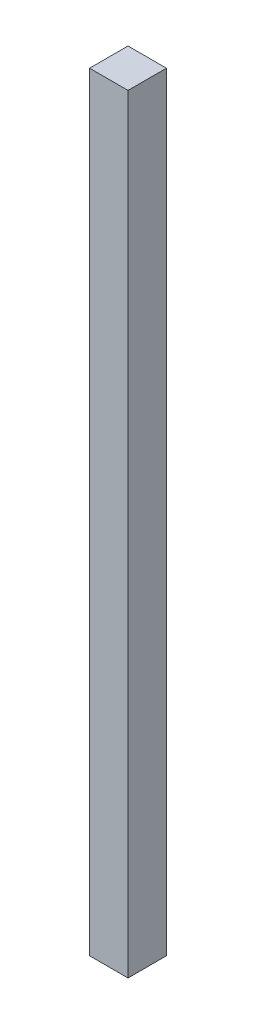
ISO-10303-21;
HEADER;
FILE_DESCRIPTION(('STEP AP214'),'2;1');
FILE_NAME('part.step','',(''),(''),'','','');
FILE_SCHEMA(('AUTOMOTIVE_DESIGN { 1 0 10303 214 1 1 1 1 }'));
ENDSEC;
DATA;
#1=APPLICATION_CONTEXT('core data for automotive mechanical design processes');
#2=APPLICATION_PROTOCOL_DEFINITION('international standard','automotive_design',2000,#1);
#3=PRODUCT_CONTEXT('',#1,'mechanical');
#4=PRODUCT('Part','Part','',(#3));
#5=PRODUCT_RELATED_PRODUCT_CATEGORY('part','',(#4));
#6=PRODUCT_DEFINITION_FORMATION('','',#4);
#7=PRODUCT_DEFINITION_CONTEXT('part definition',#1,'design');
#8=PRODUCT_DEFINITION('design','',#6,#7);
#9=PRODUCT_DEFINITION_SHAPE('','',#8);
#10=(LENGTH_UNIT() NAMED_UNIT(*) SI_UNIT(.MILLI.,.METRE.));
#11=(NAMED_UNIT(*) PLANE_ANGLE_UNIT() SI_UNIT($,.RADIAN.));
#12=(NAMED_UNIT(*) SI_UNIT($,.STERADIAN.) SOLID_ANGLE_UNIT());
#13=UNCERTAINTY_MEASURE_WITH_UNIT(LENGTH_MEASURE(1.E-05),#10,'distance_accuracy_value','');
#14=(GEOMETRIC_REPRESENTATION_CONTEXT(3) GLOBAL_UNCERTAINTY_ASSIGNED_CONTEXT((#13)) GLOBAL_UNIT_ASSIGNED_CONTEXT((#10,
#11,#12)) REPRESENTATION_CONTEXT('',''));
#15=CARTESIAN_POINT('',(0.,0.,0.));
#16=DIRECTION('',(0.,0.,1.));
#17=DIRECTION('',(1.,0.,0.));
#18=AXIS2_PLACEMENT_3D('',#15,#16,#17);
#19=CARTESIAN_POINT('',(0.,400.,0.));
#20=DIRECTION('',(1.,0.,0.));
#21=DIRECTION('',(0.,0.,-1.));
#22=AXIS2_PLACEMENT_3D('',#19,#20,#21);
#23=PLANE('',#22);
#24=DIRECTION('',(0.,0.,1.));
#25=VECTOR('',#24,1.);
#26=CARTESIAN_POINT('',(0.,0.,0.));
#27=LINE('',#26,#25);
#28=CARTESIAN_POINT('',(0.,0.,0.));
#29=VERTEX_POINT('',#28);
#30=CARTESIAN_POINT('',(0.,0.,20.));
#31=VERTEX_POINT('',#30);
#32=EDGE_CURVE('E96',#29,#31,#27,.T.);
#33=ORIENTED_EDGE('',*,*,#32,.T.);
#34=DIRECTION('',(0.,-1.,0.));
#35=VECTOR('',#34,1.);
#36=CARTESIAN_POINT('',(0.,400.,20.));
#37=LINE('',#36,#35);
#38=CARTESIAN_POINT('',(0.,400.,20.));
#39=VERTEX_POINT('',#38);
#40=EDGE_CURVE('E11',#39,#31,#37,.T.);
#41=ORIENTED_EDGE('',*,*,#40,.F.);
#42=DIRECTION('',(0.,0.,1.));
#43=VECTOR('',#42,1.);
#44=CARTESIAN_POINT('',(0.,400.,0.));
#45=LINE('',#44,#43);
#46=CARTESIAN_POINT('',(0.,400.,0.));
#47=VERTEX_POINT('',#46);
#48=EDGE_CURVE('E84',#47,#39,#45,.T.);
#49=ORIENTED_EDGE('',*,*,#48,.F.);
#50=DIRECTION('',(0.,-1.,0.));
#51=VECTOR('',#50,1.);
#52=CARTESIAN_POINT('',(0.,400.,0.));
#53=LINE('',#52,#51);
#54=EDGE_CURVE('E92',#47,#29,#53,.T.);
#55=ORIENTED_EDGE('',*,*,#54,.T.);
#56=EDGE_LOOP('',(#33,#41,#49,#55));
#57=FACE_BOUND('',#56,.T.);
#58=ADVANCED_FACE('F33',(#57),#23,.F.);
#59=CARTESIAN_POINT('',(0.,400.,20.));
#60=DIRECTION('',(0.,0.,-1.));
#61=DIRECTION('',(-1.,0.,0.));
#62=AXIS2_PLACEMENT_3D('',#59,#60,#61);
#63=PLANE('',#62);
#64=DIRECTION('',(1.,0.,0.));
#65=VECTOR('',#64,1.);
#66=CARTESIAN_POINT('',(0.,0.,20.));
#67=LINE('',#66,#65);
#68=CARTESIAN_POINT('',(20.,0.,20.));
#69=VERTEX_POINT('',#68);
#70=EDGE_CURVE('E88',#31,#69,#67,.T.);
#71=ORIENTED_EDGE('',*,*,#70,.T.);
#72=DIRECTION('',(0.,-1.,0.));
#73=VECTOR('',#72,1.);
#74=CARTESIAN_POINT('',(20.,400.,20.));
#75=LINE('',#74,#73);
#76=CARTESIAN_POINT('',(20.,400.,20.));
#77=VERTEX_POINT('',#76);
#78=EDGE_CURVE('E41',#77,#69,#75,.T.);
#79=ORIENTED_EDGE('',*,*,#78,.F.);
#80=DIRECTION('',(1.,0.,0.));
#81=VECTOR('',#80,1.);
#82=CARTESIAN_POINT('',(0.,400.,20.));
#83=LINE('',#82,#81);
#84=EDGE_CURVE('E79',#39,#77,#83,.T.);
#85=ORIENTED_EDGE('',*,*,#84,.F.);
#86=ORIENTED_EDGE('',*,*,#40,.T.);
#87=EDGE_LOOP('',(#71,#79,#85,#86));
#88=FACE_BOUND('',#87,.T.);
#89=ADVANCED_FACE('F87',(#88),#63,.F.);
#90=CARTESIAN_POINT('',(20.,400.,0.));
#91=DIRECTION('',(-1.,0.,0.));
#92=DIRECTION('',(0.,0.,1.));
#93=AXIS2_PLACEMENT_3D('',#90,#91,#92);
#94=PLANE('',#93);
#95=DIRECTION('',(0.,0.,-1.));
#96=VECTOR('',#95,1.);
#97=CARTESIAN_POINT('',(20.,0.,0.));
#98=LINE('',#97,#96);
#99=CARTESIAN_POINT('',(20.,0.,0.));
#100=VERTEX_POINT('',#99);
#101=EDGE_CURVE('E66',#69,#100,#98,.T.);
#102=ORIENTED_EDGE('',*,*,#101,.T.);
#103=DIRECTION('',(0.,-1.,0.));
#104=VECTOR('',#103,1.);
#105=CARTESIAN_POINT('',(20.,400.,0.));
#106=LINE('',#105,#104);
#107=CARTESIAN_POINT('',(20.,400.,0.));
#108=VERTEX_POINT('',#107);
#109=EDGE_CURVE('E89',#108,#100,#106,.T.);
#110=ORIENTED_EDGE('',*,*,#109,.F.);
#111=DIRECTION('',(0.,0.,-1.));
#112=VECTOR('',#111,1.);
#113=CARTESIAN_POINT('',(20.,400.,0.));
#114=LINE('',#113,#112);
#115=EDGE_CURVE('E82',#77,#108,#114,.T.);
#116=ORIENTED_EDGE('',*,*,#115,.F.);
#117=ORIENTED_EDGE('',*,*,#78,.T.);
#118=EDGE_LOOP('',(#102,#110,#116,#117));
#119=FACE_BOUND('',#118,.T.);
#120=ADVANCED_FACE('F90',(#119),#94,.F.);
#121=CARTESIAN_POINT('',(0.,400.,0.));
#122=DIRECTION('',(0.,0.,1.));
#123=DIRECTION('',(1.,0.,0.));
#124=AXIS2_PLACEMENT_3D('',#121,#122,#123);
#125=PLANE('',#124);
#126=DIRECTION('',(-1.,0.,0.));
#127=VECTOR('',#126,1.);
#128=CARTESIAN_POINT('',(0.,0.,0.));
#129=LINE('',#128,#127);
#130=EDGE_CURVE('E72',#100,#29,#129,.T.);
#131=ORIENTED_EDGE('',*,*,#130,.T.);
#132=ORIENTED_EDGE('',*,*,#54,.F.);
#133=DIRECTION('',(-1.,0.,0.));
#134=VECTOR('',#133,1.);
#135=CARTESIAN_POINT('',(0.,400.,0.));
#136=LINE('',#135,#134);
#137=EDGE_CURVE('E49',#108,#47,#136,.T.);
#138=ORIENTED_EDGE('',*,*,#137,.F.);
#139=ORIENTED_EDGE('',*,*,#109,.T.);
#140=EDGE_LOOP('',(#131,#132,#138,#139));
#141=FACE_BOUND('',#140,.T.);
#142=ADVANCED_FACE('F103',(#141),#125,.F.);
#143=CARTESIAN_POINT('',(0.,400.,0.));
#144=DIRECTION('',(0.,1.,0.));
#145=DIRECTION('',(0.,0.,1.));
#146=AXIS2_PLACEMENT_3D('',#143,#144,#145);
#147=PLANE('',#146);
#148=ORIENTED_EDGE('',*,*,#48,.T.);
#149=ORIENTED_EDGE('',*,*,#84,.T.);
#150=ORIENTED_EDGE('',*,*,#115,.T.);
#151=ORIENTED_EDGE('',*,*,#137,.T.);
#152=EDGE_LOOP('',(#148,#149,#150,#151));
#153=FACE_BOUND('',#152,.T.);
#154=ADVANCED_FACE('F80',(#153),#147,.T.);
#155=CARTESIAN_POINT('',(0.,0.,0.));
#156=DIRECTION('',(0.,1.,0.));
#157=DIRECTION('',(0.,0.,1.));
#158=AXIS2_PLACEMENT_3D('',#155,#156,#157);
#159=PLANE('',#158);
#160=ORIENTED_EDGE('',*,*,#32,.F.);
#161=ORIENTED_EDGE('',*,*,#130,.F.);
#162=ORIENTED_EDGE('',*,*,#101,.F.);
#163=ORIENTED_EDGE('',*,*,#70,.F.);
#164=EDGE_LOOP('',(#160,#161,#162,#163));
#165=FACE_BOUND('',#164,.T.);
#166=ADVANCED_FACE('F106',(#165),#159,.F.);
#167=CLOSED_SHELL('',(#58,#89,#120,#142,#154,#166));
#168=MANIFOLD_SOLID_BREP('B2',#167);
#169=ADVANCED_BREP_SHAPE_REPRESENTATION('',(#18,#168),#14);
#170=SHAPE_DEFINITION_REPRESENTATION(#9,#169);
ENDSEC;
END-ISO-10303-21;
